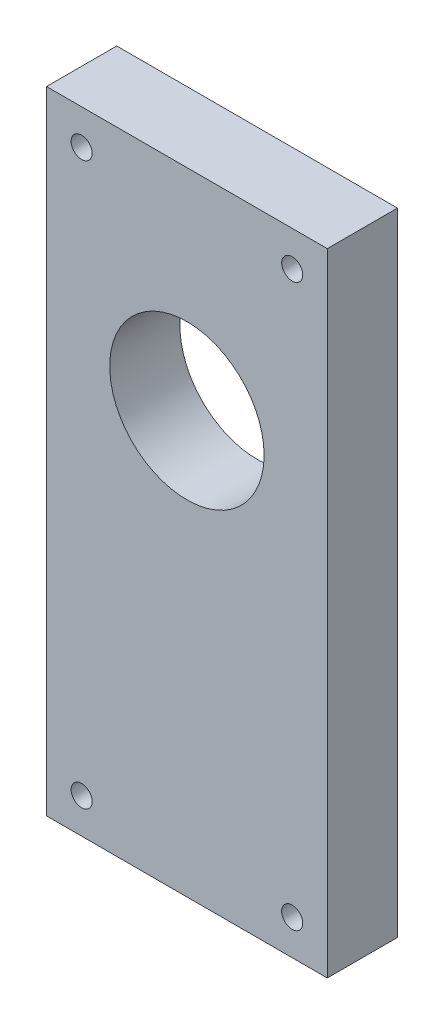
ISO-10303-21;
HEADER;
FILE_DESCRIPTION(('STEP AP214'),'2;1');
FILE_NAME('part.step','',(''),(''),'','','');
FILE_SCHEMA(('AUTOMOTIVE_DESIGN { 1 0 10303 214 1 1 1 1 }'));
ENDSEC;
DATA;
#1=APPLICATION_CONTEXT('core data for automotive mechanical design processes');
#2=APPLICATION_PROTOCOL_DEFINITION('international standard','automotive_design',2000,#1);
#3=PRODUCT_CONTEXT('',#1,'mechanical');
#4=PRODUCT('Part','Part','',(#3));
#5=PRODUCT_RELATED_PRODUCT_CATEGORY('part','',(#4));
#6=PRODUCT_DEFINITION_FORMATION('','',#4);
#7=PRODUCT_DEFINITION_CONTEXT('part definition',#1,'design');
#8=PRODUCT_DEFINITION('design','',#6,#7);
#9=PRODUCT_DEFINITION_SHAPE('','',#8);
#10=(LENGTH_UNIT() NAMED_UNIT(*) SI_UNIT(.MILLI.,.METRE.));
#11=(NAMED_UNIT(*) PLANE_ANGLE_UNIT() SI_UNIT($,.RADIAN.));
#12=(NAMED_UNIT(*) SI_UNIT($,.STERADIAN.) SOLID_ANGLE_UNIT());
#13=UNCERTAINTY_MEASURE_WITH_UNIT(LENGTH_MEASURE(1.E-05),#10,'distance_accuracy_value','');
#14=(GEOMETRIC_REPRESENTATION_CONTEXT(3) GLOBAL_UNCERTAINTY_ASSIGNED_CONTEXT((#13)) GLOBAL_UNIT_ASSIGNED_CONTEXT((#10,
#11,#12)) REPRESENTATION_CONTEXT('',''));
#15=CARTESIAN_POINT('',(0.,0.,0.));
#16=DIRECTION('',(0.,0.,1.));
#17=DIRECTION('',(1.,0.,0.));
#18=AXIS2_PLACEMENT_3D('',#15,#16,#17);
#19=CARTESIAN_POINT('',(-84.1890789026433,9.11481476205095,10.));
#20=DIRECTION('',(0.,0.,-1.));
#21=DIRECTION('',(-1.,0.,0.));
#22=AXIS2_PLACEMENT_3D('',#19,#20,#21);
#23=CYLINDRICAL_SURFACE('',#22,11.);
#24=CARTESIAN_POINT('',(-84.1890789026433,9.11481476205095,0.));
#25=DIRECTION('',(0.,0.,1.));
#26=DIRECTION('',(1.,0.,0.));
#27=AXIS2_PLACEMENT_3D('',#24,#25,#26);
#28=CIRCLE('',#27,11.);
#29=CARTESIAN_POINT('',(-73.1890789026434,9.11481476205095,0.));
#30=VERTEX_POINT('',#29);
#31=EDGE_CURVE('E95',#30,#30,#28,.T.);
#32=ORIENTED_EDGE('',*,*,#31,.F.);
#33=EDGE_LOOP('',(#32));
#34=FACE_BOUND('',#33,.T.);
#35=CARTESIAN_POINT('',(-84.1890789026433,9.11481476205095,10.));
#36=DIRECTION('',(0.,0.,1.));
#37=DIRECTION('',(1.,0.,0.));
#38=AXIS2_PLACEMENT_3D('',#35,#36,#37);
#39=CIRCLE('',#38,11.);
#40=CARTESIAN_POINT('',(-73.1890789026434,9.11481476205095,10.));
#41=VERTEX_POINT('',#40);
#42=EDGE_CURVE('E134',#41,#41,#39,.T.);
#43=ORIENTED_EDGE('',*,*,#42,.T.);
#44=EDGE_LOOP('',(#43));
#45=FACE_BOUND('',#44,.T.);
#46=ADVANCED_FACE('F41',(#34,#45),#23,.F.);
#47=CARTESIAN_POINT('',(0.,39.114814762051,10.));
#48=DIRECTION('',(0.,1.,0.));
#49=DIRECTION('',(-1.,0.,0.));
#50=AXIS2_PLACEMENT_3D('',#47,#48,#49);
#51=PLANE('',#50);
#52=DIRECTION('',(1.,0.,0.));
#53=VECTOR('',#52,1.);
#54=CARTESIAN_POINT('',(0.,39.114814762051,0.));
#55=LINE('',#54,#53);
#56=CARTESIAN_POINT('',(-104.189078902643,39.1148147620509,0.));
#57=VERTEX_POINT('',#56);
#58=CARTESIAN_POINT('',(-64.1890789026433,39.1148147620509,0.));
#59=VERTEX_POINT('',#58);
#60=EDGE_CURVE('E88',#57,#59,#55,.T.);
#61=ORIENTED_EDGE('',*,*,#60,.F.);
#62=DIRECTION('',(0.,0.,-1.));
#63=VECTOR('',#62,1.);
#64=CARTESIAN_POINT('',(-104.189078902643,39.1148147620509,10.));
#65=LINE('',#64,#63);
#66=CARTESIAN_POINT('',(-104.189078902643,39.1148147620509,10.));
#67=VERTEX_POINT('',#66);
#68=EDGE_CURVE('E11',#67,#57,#65,.T.);
#69=ORIENTED_EDGE('',*,*,#68,.F.);
#70=DIRECTION('',(1.,0.,0.));
#71=VECTOR('',#70,1.);
#72=CARTESIAN_POINT('',(0.,39.114814762051,10.));
#73=LINE('',#72,#71);
#74=CARTESIAN_POINT('',(-64.1890789026433,39.1148147620509,10.));
#75=VERTEX_POINT('',#74);
#76=EDGE_CURVE('E77',#67,#75,#73,.T.);
#77=ORIENTED_EDGE('',*,*,#76,.T.);
#78=DIRECTION('',(0.,0.,-1.));
#79=VECTOR('',#78,1.);
#80=CARTESIAN_POINT('',(-64.1890789026433,39.1148147620509,10.));
#81=LINE('',#80,#79);
#82=EDGE_CURVE('E97',#75,#59,#81,.T.);
#83=ORIENTED_EDGE('',*,*,#82,.T.);
#84=EDGE_LOOP('',(#61,#69,#77,#83));
#85=FACE_BOUND('',#84,.T.);
#86=ADVANCED_FACE('F98',(#85),#51,.T.);
#87=CARTESIAN_POINT('',(-104.189078902643,0.,10.));
#88=DIRECTION('',(1.,0.,0.));
#89=DIRECTION('',(0.,0.,-1.));
#90=AXIS2_PLACEMENT_3D('',#87,#88,#89);
#91=PLANE('',#90);
#92=DIRECTION('',(0.,-1.,0.));
#93=VECTOR('',#92,1.);
#94=CARTESIAN_POINT('',(-104.189078902643,0.,0.));
#95=LINE('',#94,#93);
#96=CARTESIAN_POINT('',(-104.189078902643,-50.885185237949,0.));
#97=VERTEX_POINT('',#96);
#98=EDGE_CURVE('E93',#57,#97,#95,.T.);
#99=ORIENTED_EDGE('',*,*,#98,.T.);
#100=DIRECTION('',(0.,0.,-1.));
#101=VECTOR('',#100,1.);
#102=CARTESIAN_POINT('',(-104.189078902643,-50.885185237949,10.));
#103=LINE('',#102,#101);
#104=CARTESIAN_POINT('',(-104.189078902643,-50.885185237949,10.));
#105=VERTEX_POINT('',#104);
#106=EDGE_CURVE('E51',#105,#97,#103,.T.);
#107=ORIENTED_EDGE('',*,*,#106,.F.);
#108=DIRECTION('',(0.,-1.,0.));
#109=VECTOR('',#108,1.);
#110=CARTESIAN_POINT('',(-104.189078902643,0.,10.));
#111=LINE('',#110,#109);
#112=EDGE_CURVE('E140',#67,#105,#111,.T.);
#113=ORIENTED_EDGE('',*,*,#112,.F.);
#114=ORIENTED_EDGE('',*,*,#68,.T.);
#115=EDGE_LOOP('',(#99,#107,#113,#114));
#116=FACE_BOUND('',#115,.T.);
#117=ADVANCED_FACE('F161',(#116),#91,.F.);
#118=CARTESIAN_POINT('',(0.,-50.8851852379491,10.));
#119=DIRECTION('',(0.,1.,0.));
#120=DIRECTION('',(-1.,0.,0.));
#121=AXIS2_PLACEMENT_3D('',#118,#119,#120);
#122=PLANE('',#121);
#123=DIRECTION('',(1.,0.,0.));
#124=VECTOR('',#123,1.);
#125=CARTESIAN_POINT('',(0.,-50.8851852379491,0.));
#126=LINE('',#125,#124);
#127=CARTESIAN_POINT('',(-64.1890789026433,-50.885185237949,0.));
#128=VERTEX_POINT('',#127);
#129=EDGE_CURVE('E130',#97,#128,#126,.T.);
#130=ORIENTED_EDGE('',*,*,#129,.T.);
#131=DIRECTION('',(0.,0.,-1.));
#132=VECTOR('',#131,1.);
#133=CARTESIAN_POINT('',(-64.1890789026433,-50.885185237949,10.));
#134=LINE('',#133,#132);
#135=CARTESIAN_POINT('',(-64.1890789026433,-50.885185237949,10.));
#136=VERTEX_POINT('',#135);
#137=EDGE_CURVE('E103',#136,#128,#134,.T.);
#138=ORIENTED_EDGE('',*,*,#137,.F.);
#139=DIRECTION('',(1.,0.,0.));
#140=VECTOR('',#139,1.);
#141=CARTESIAN_POINT('',(0.,-50.8851852379491,10.));
#142=LINE('',#141,#140);
#143=EDGE_CURVE('E59',#105,#136,#142,.T.);
#144=ORIENTED_EDGE('',*,*,#143,.F.);
#145=ORIENTED_EDGE('',*,*,#106,.T.);
#146=EDGE_LOOP('',(#130,#138,#144,#145));
#147=FACE_BOUND('',#146,.T.);
#148=ADVANCED_FACE('F160',(#147),#122,.F.);
#149=CARTESIAN_POINT('',(-99.1890789026433,34.1148147620509,10.));
#150=DIRECTION('',(0.,0.,-1.));
#151=DIRECTION('',(-1.,0.,0.));
#152=AXIS2_PLACEMENT_3D('',#149,#150,#151);
#153=CYLINDRICAL_SURFACE('',#152,1.49999999999991);
#154=CARTESIAN_POINT('',(-99.1890789026433,34.1148147620509,10.));
#155=DIRECTION('',(0.,0.,1.));
#156=DIRECTION('',(1.,0.,0.));
#157=AXIS2_PLACEMENT_3D('',#154,#155,#156);
#158=CIRCLE('',#157,1.49999999999991);
#159=CARTESIAN_POINT('',(-97.6890789026434,34.1148147620509,10.));
#160=VERTEX_POINT('',#159);
#161=EDGE_CURVE('E129',#160,#160,#158,.T.);
#162=ORIENTED_EDGE('',*,*,#161,.T.);
#163=EDGE_LOOP('',(#162));
#164=FACE_BOUND('',#163,.T.);
#165=CARTESIAN_POINT('',(-99.1890789026433,34.1148147620509,0.));
#166=DIRECTION('',(0.,0.,1.));
#167=DIRECTION('',(1.,0.,0.));
#168=AXIS2_PLACEMENT_3D('',#165,#166,#167);
#169=CIRCLE('',#168,1.49999999999991);
#170=CARTESIAN_POINT('',(-97.6890789026434,34.1148147620509,0.));
#171=VERTEX_POINT('',#170);
#172=EDGE_CURVE('E148',#171,#171,#169,.T.);
#173=ORIENTED_EDGE('',*,*,#172,.F.);
#174=EDGE_LOOP('',(#173));
#175=FACE_BOUND('',#174,.T.);
#176=ADVANCED_FACE('F168',(#164,#175),#153,.F.);
#177=CARTESIAN_POINT('',(-99.1890789026433,-45.8851852379491,10.));
#178=DIRECTION('',(0.,0.,-1.));
#179=DIRECTION('',(-1.,0.,0.));
#180=AXIS2_PLACEMENT_3D('',#177,#178,#179);
#181=CYLINDRICAL_SURFACE('',#180,1.5);
#182=CARTESIAN_POINT('',(-99.1890789026433,-45.8851852379491,10.));
#183=DIRECTION('',(0.,0.,1.));
#184=DIRECTION('',(1.,0.,0.));
#185=AXIS2_PLACEMENT_3D('',#182,#183,#184);
#186=CIRCLE('',#185,1.5);
#187=CARTESIAN_POINT('',(-97.6890789026433,-45.8851852379491,10.));
#188=VERTEX_POINT('',#187);
#189=EDGE_CURVE('E125',#188,#188,#186,.T.);
#190=ORIENTED_EDGE('',*,*,#189,.T.);
#191=EDGE_LOOP('',(#190));
#192=FACE_BOUND('',#191,.T.);
#193=CARTESIAN_POINT('',(-99.1890789026433,-45.8851852379491,0.));
#194=DIRECTION('',(0.,0.,1.));
#195=DIRECTION('',(1.,0.,0.));
#196=AXIS2_PLACEMENT_3D('',#193,#194,#195);
#197=CIRCLE('',#196,1.5);
#198=CARTESIAN_POINT('',(-97.6890789026433,-45.8851852379491,0.));
#199=VERTEX_POINT('',#198);
#200=EDGE_CURVE('E124',#199,#199,#197,.T.);
#201=ORIENTED_EDGE('',*,*,#200,.F.);
#202=EDGE_LOOP('',(#201));
#203=FACE_BOUND('',#202,.T.);
#204=ADVANCED_FACE('F43',(#192,#203),#181,.F.);
#205=CARTESIAN_POINT('',(0.,0.,10.));
#206=DIRECTION('',(0.,0.,1.));
#207=DIRECTION('',(1.,0.,0.));
#208=AXIS2_PLACEMENT_3D('',#205,#206,#207);
#209=PLANE('',#208);
#210=ORIENTED_EDGE('',*,*,#143,.T.);
#211=DIRECTION('',(0.,-1.,0.));
#212=VECTOR('',#211,1.);
#213=CARTESIAN_POINT('',(-64.1890789026433,0.,10.));
#214=LINE('',#213,#212);
#215=EDGE_CURVE('E104',#75,#136,#214,.T.);
#216=ORIENTED_EDGE('',*,*,#215,.F.);
#217=ORIENTED_EDGE('',*,*,#76,.F.);
#218=ORIENTED_EDGE('',*,*,#112,.T.);
#219=EDGE_LOOP('',(#210,#216,#217,#218));
#220=FACE_BOUND('',#219,.T.);
#221=ORIENTED_EDGE('',*,*,#189,.F.);
#222=EDGE_LOOP('',(#221));
#223=FACE_BOUND('',#222,.T.);
#224=ORIENTED_EDGE('',*,*,#161,.F.);
#225=EDGE_LOOP('',(#224));
#226=FACE_BOUND('',#225,.T.);
#227=ORIENTED_EDGE('',*,*,#42,.F.);
#228=EDGE_LOOP('',(#227));
#229=FACE_BOUND('',#228,.T.);
#230=CARTESIAN_POINT('',(-69.1890789026433,-45.8851852379491,10.));
#231=DIRECTION('',(0.,0.,-1.));
#232=DIRECTION('',(-1.,0.,0.));
#233=AXIS2_PLACEMENT_3D('',#230,#231,#232);
#234=CIRCLE('',#233,1.5);
#235=CARTESIAN_POINT('',(-70.6890789026433,-45.8851852379491,10.));
#236=VERTEX_POINT('',#235);
#237=EDGE_CURVE('E109',#236,#236,#234,.T.);
#238=ORIENTED_EDGE('',*,*,#237,.T.);
#239=EDGE_LOOP('',(#238));
#240=FACE_BOUND('',#239,.T.);
#241=CARTESIAN_POINT('',(-69.1890789026433,34.1148147620509,10.));
#242=DIRECTION('',(0.,0.,-1.));
#243=DIRECTION('',(-1.,0.,0.));
#244=AXIS2_PLACEMENT_3D('',#241,#242,#243);
#245=CIRCLE('',#244,1.49999999999991);
#246=CARTESIAN_POINT('',(-70.6890789026432,34.1148147620509,10.));
#247=VERTEX_POINT('',#246);
#248=EDGE_CURVE('E115',#247,#247,#245,.T.);
#249=ORIENTED_EDGE('',*,*,#248,.T.);
#250=EDGE_LOOP('',(#249));
#251=FACE_BOUND('',#250,.T.);
#252=ADVANCED_FACE('F183',(#220,#223,#226,#229,#240,#251),#209,.T.);
#253=CARTESIAN_POINT('',(0.,0.,0.));
#254=DIRECTION('',(0.,0.,1.));
#255=DIRECTION('',(1.,0.,0.));
#256=AXIS2_PLACEMENT_3D('',#253,#254,#255);
#257=PLANE('',#256);
#258=DIRECTION('',(0.,-1.,0.));
#259=VECTOR('',#258,1.);
#260=CARTESIAN_POINT('',(-64.1890789026433,0.,0.));
#261=LINE('',#260,#259);
#262=EDGE_CURVE('E92',#59,#128,#261,.T.);
#263=ORIENTED_EDGE('',*,*,#262,.T.);
#264=ORIENTED_EDGE('',*,*,#129,.F.);
#265=ORIENTED_EDGE('',*,*,#98,.F.);
#266=ORIENTED_EDGE('',*,*,#60,.T.);
#267=EDGE_LOOP('',(#263,#264,#265,#266));
#268=FACE_BOUND('',#267,.T.);
#269=ORIENTED_EDGE('',*,*,#200,.T.);
#270=EDGE_LOOP('',(#269));
#271=FACE_BOUND('',#270,.T.);
#272=ORIENTED_EDGE('',*,*,#172,.T.);
#273=EDGE_LOOP('',(#272));
#274=FACE_BOUND('',#273,.T.);
#275=ORIENTED_EDGE('',*,*,#31,.T.);
#276=EDGE_LOOP('',(#275));
#277=FACE_BOUND('',#276,.T.);
#278=CARTESIAN_POINT('',(-69.1890789026433,-45.8851852379491,0.));
#279=DIRECTION('',(0.,0.,-1.));
#280=DIRECTION('',(-1.,0.,0.));
#281=AXIS2_PLACEMENT_3D('',#278,#279,#280);
#282=CIRCLE('',#281,1.5);
#283=CARTESIAN_POINT('',(-70.6890789026433,-45.8851852379491,0.));
#284=VERTEX_POINT('',#283);
#285=EDGE_CURVE('E118',#284,#284,#282,.T.);
#286=ORIENTED_EDGE('',*,*,#285,.F.);
#287=EDGE_LOOP('',(#286));
#288=FACE_BOUND('',#287,.T.);
#289=CARTESIAN_POINT('',(-69.1890789026433,34.1148147620509,0.));
#290=DIRECTION('',(0.,0.,-1.));
#291=DIRECTION('',(-1.,0.,0.));
#292=AXIS2_PLACEMENT_3D('',#289,#290,#291);
#293=CIRCLE('',#292,1.49999999999991);
#294=CARTESIAN_POINT('',(-70.6890789026432,34.1148147620509,0.));
#295=VERTEX_POINT('',#294);
#296=EDGE_CURVE('E110',#295,#295,#293,.T.);
#297=ORIENTED_EDGE('',*,*,#296,.F.);
#298=EDGE_LOOP('',(#297));
#299=FACE_BOUND('',#298,.T.);
#300=ADVANCED_FACE('F89',(#268,#271,#274,#277,#288,#299),#257,.F.);
#301=CARTESIAN_POINT('',(-64.1890789026433,0.,10.));
#302=DIRECTION('',(1.,0.,0.));
#303=DIRECTION('',(0.,0.,-1.));
#304=AXIS2_PLACEMENT_3D('',#301,#302,#303);
#305=PLANE('',#304);
#306=ORIENTED_EDGE('',*,*,#262,.F.);
#307=ORIENTED_EDGE('',*,*,#82,.F.);
#308=ORIENTED_EDGE('',*,*,#215,.T.);
#309=ORIENTED_EDGE('',*,*,#137,.T.);
#310=EDGE_LOOP('',(#306,#307,#308,#309));
#311=FACE_BOUND('',#310,.T.);
#312=ADVANCED_FACE('F107',(#311),#305,.T.);
#313=CARTESIAN_POINT('',(-69.1890789026433,34.1148147620509,10.));
#314=DIRECTION('',(0.,0.,-1.));
#315=DIRECTION('',(-1.,0.,0.));
#316=AXIS2_PLACEMENT_3D('',#313,#314,#315);
#317=CYLINDRICAL_SURFACE('',#316,1.49999999999991);
#318=ORIENTED_EDGE('',*,*,#248,.F.);
#319=EDGE_LOOP('',(#318));
#320=FACE_BOUND('',#319,.T.);
#321=ORIENTED_EDGE('',*,*,#296,.T.);
#322=EDGE_LOOP('',(#321));
#323=FACE_BOUND('',#322,.T.);
#324=ADVANCED_FACE('F198',(#320,#323),#317,.F.);
#325=CARTESIAN_POINT('',(-69.1890789026433,-45.8851852379491,10.));
#326=DIRECTION('',(0.,0.,-1.));
#327=DIRECTION('',(-1.,0.,0.));
#328=AXIS2_PLACEMENT_3D('',#325,#326,#327);
#329=CYLINDRICAL_SURFACE('',#328,1.5);
#330=ORIENTED_EDGE('',*,*,#237,.F.);
#331=EDGE_LOOP('',(#330));
#332=FACE_BOUND('',#331,.T.);
#333=ORIENTED_EDGE('',*,*,#285,.T.);
#334=EDGE_LOOP('',(#333));
#335=FACE_BOUND('',#334,.T.);
#336=ADVANCED_FACE('F200',(#332,#335),#329,.F.);
#337=CLOSED_SHELL('',(#46,#86,#117,#148,#176,#204,#252,#300,#312,#324,#336));
#338=MANIFOLD_SOLID_BREP('B2',#337);
#339=ADVANCED_BREP_SHAPE_REPRESENTATION('',(#18,#338),#14);
#340=SHAPE_DEFINITION_REPRESENTATION(#9,#339);
ENDSEC;
END-ISO-10303-21;
